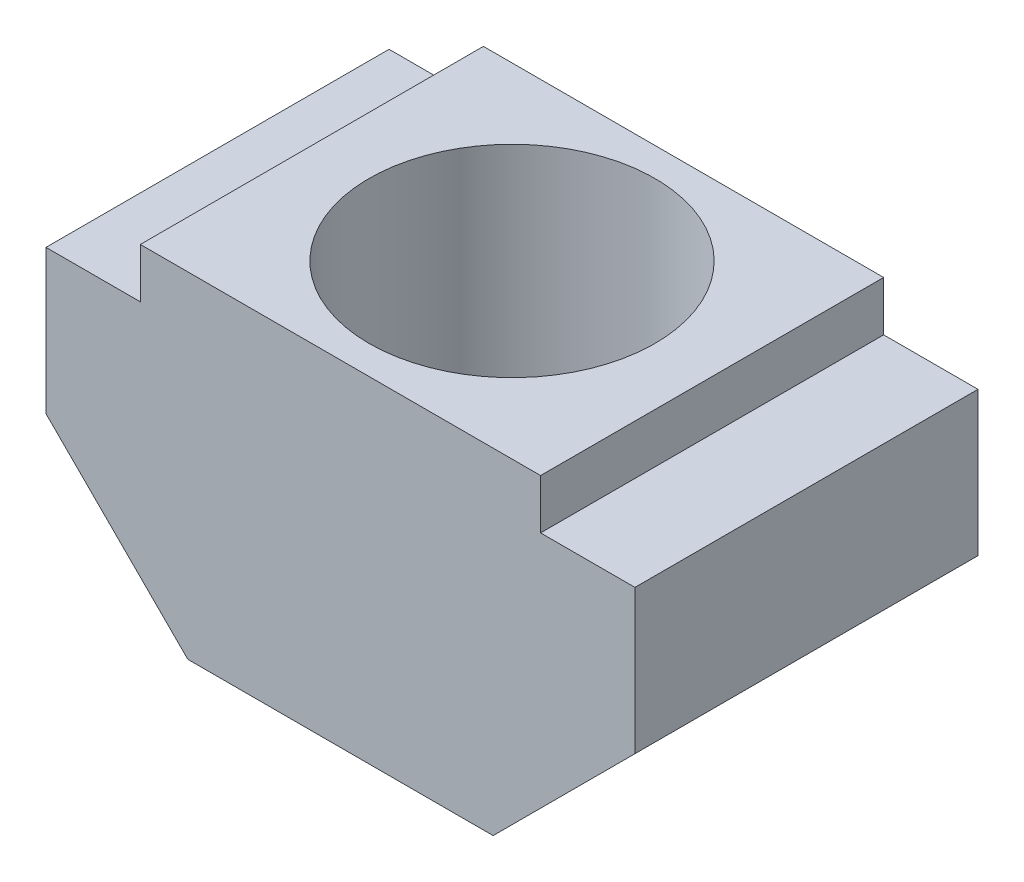
ISO-10303-21;
HEADER;
FILE_DESCRIPTION(('STEP AP214'),'2;1');
FILE_NAME('part.step','',(''),(''),'','','');
FILE_SCHEMA(('AUTOMOTIVE_DESIGN { 1 0 10303 214 1 1 1 1 }'));
ENDSEC;
DATA;
#1=APPLICATION_CONTEXT('core data for automotive mechanical design processes');
#2=APPLICATION_PROTOCOL_DEFINITION('international standard','automotive_design',2000,#1);
#3=PRODUCT_CONTEXT('',#1,'mechanical');
#4=PRODUCT('Part','Part','',(#3));
#5=PRODUCT_RELATED_PRODUCT_CATEGORY('part','',(#4));
#6=PRODUCT_DEFINITION_FORMATION('','',#4);
#7=PRODUCT_DEFINITION_CONTEXT('part definition',#1,'design');
#8=PRODUCT_DEFINITION('design','',#6,#7);
#9=PRODUCT_DEFINITION_SHAPE('','',#8);
#10=(LENGTH_UNIT() NAMED_UNIT(*) SI_UNIT(.MILLI.,.METRE.));
#11=(NAMED_UNIT(*) PLANE_ANGLE_UNIT() SI_UNIT($,.RADIAN.));
#12=(NAMED_UNIT(*) SI_UNIT($,.STERADIAN.) SOLID_ANGLE_UNIT());
#13=UNCERTAINTY_MEASURE_WITH_UNIT(LENGTH_MEASURE(1.E-05),#10,'distance_accuracy_value','');
#14=(GEOMETRIC_REPRESENTATION_CONTEXT(3) GLOBAL_UNCERTAINTY_ASSIGNED_CONTEXT((#13)) GLOBAL_UNIT_ASSIGNED_CONTEXT((#10,
#11,#12)) REPRESENTATION_CONTEXT('',''));
#15=CARTESIAN_POINT('',(0.,0.,0.));
#16=DIRECTION('',(0.,0.,1.));
#17=DIRECTION('',(1.,0.,0.));
#18=AXIS2_PLACEMENT_3D('',#15,#16,#17);
#19=CARTESIAN_POINT('',(-2.66992130891577,0.,6.));
#20=DIRECTION('',(0.707106781186544,0.707106781186551,0.));
#21=DIRECTION('',(-0.707106781186551,0.707106781186544,0.));
#22=AXIS2_PLACEMENT_3D('',#19,#20,#21);
#23=PLANE('',#22);
#24=DIRECTION('',(0.707106781186551,-0.707106781186544,0.));
#25=VECTOR('',#24,1.);
#26=CARTESIAN_POINT('',(-2.66992130891577,0.,0.));
#27=LINE('',#26,#25);
#28=CARTESIAN_POINT('',(-5.15,2.48007869108421,0.));
#29=VERTEX_POINT('',#28);
#30=CARTESIAN_POINT('',(-2.66992130891577,0.,0.));
#31=VERTEX_POINT('',#30);
#32=EDGE_CURVE('E139',#29,#31,#27,.T.);
#33=ORIENTED_EDGE('',*,*,#32,.T.);
#34=DIRECTION('',(0.,0.,-1.));
#35=VECTOR('',#34,1.);
#36=CARTESIAN_POINT('',(-2.66992130891577,0.,6.));
#37=LINE('',#36,#35);
#38=CARTESIAN_POINT('',(-2.66992130891577,0.,6.));
#39=VERTEX_POINT('',#38);
#40=EDGE_CURVE('E11',#39,#31,#37,.T.);
#41=ORIENTED_EDGE('',*,*,#40,.F.);
#42=DIRECTION('',(0.707106781186551,-0.707106781186544,0.));
#43=VECTOR('',#42,1.);
#44=CARTESIAN_POINT('',(-2.66992130891577,0.,6.));
#45=LINE('',#44,#43);
#46=CARTESIAN_POINT('',(-5.15,2.48007869108421,6.));
#47=VERTEX_POINT('',#46);
#48=EDGE_CURVE('E158',#47,#39,#45,.T.);
#49=ORIENTED_EDGE('',*,*,#48,.F.);
#50=DIRECTION('',(0.,0.,-1.));
#51=VECTOR('',#50,1.);
#52=CARTESIAN_POINT('',(-5.15,2.48007869108421,6.));
#53=LINE('',#52,#51);
#54=EDGE_CURVE('E135',#47,#29,#53,.T.);
#55=ORIENTED_EDGE('',*,*,#54,.T.);
#56=EDGE_LOOP('',(#33,#41,#49,#55));
#57=FACE_BOUND('',#56,.T.);
#58=ADVANCED_FACE('F31',(#57),#23,.F.);
#59=CARTESIAN_POINT('',(2.66992130891577,0.,6.));
#60=DIRECTION('',(0.,1.,0.));
#61=DIRECTION('',(0.,0.,1.));
#62=AXIS2_PLACEMENT_3D('',#59,#60,#61);
#63=PLANE('',#62);
#64=CARTESIAN_POINT('',(0.,0.,3.));
#65=DIRECTION('',(0.,1.,0.));
#66=DIRECTION('',(0.,0.,1.));
#67=AXIS2_PLACEMENT_3D('',#64,#65,#66);
#68=CIRCLE('',#67,2.5);
#69=CARTESIAN_POINT('',(0.,0.,5.5));
#70=VERTEX_POINT('',#69);
#71=EDGE_CURVE('E143',#70,#70,#68,.T.);
#72=ORIENTED_EDGE('',*,*,#71,.T.);
#73=EDGE_LOOP('',(#72));
#74=FACE_BOUND('',#73,.T.);
#75=DIRECTION('',(1.,0.,0.));
#76=VECTOR('',#75,1.);
#77=CARTESIAN_POINT('',(2.66992130891577,0.,0.));
#78=LINE('',#77,#76);
#79=CARTESIAN_POINT('',(2.66992130891577,0.,0.));
#80=VERTEX_POINT('',#79);
#81=EDGE_CURVE('E142',#31,#80,#78,.T.);
#82=ORIENTED_EDGE('',*,*,#81,.T.);
#83=DIRECTION('',(0.,0.,-1.));
#84=VECTOR('',#83,1.);
#85=CARTESIAN_POINT('',(2.66992130891577,0.,6.));
#86=LINE('',#85,#84);
#87=CARTESIAN_POINT('',(2.66992130891577,0.,6.));
#88=VERTEX_POINT('',#87);
#89=EDGE_CURVE('E39',#88,#80,#86,.T.);
#90=ORIENTED_EDGE('',*,*,#89,.F.);
#91=DIRECTION('',(1.,0.,0.));
#92=VECTOR('',#91,1.);
#93=CARTESIAN_POINT('',(2.66992130891577,0.,6.));
#94=LINE('',#93,#92);
#95=EDGE_CURVE('E96',#39,#88,#94,.T.);
#96=ORIENTED_EDGE('',*,*,#95,.F.);
#97=ORIENTED_EDGE('',*,*,#40,.T.);
#98=EDGE_LOOP('',(#82,#90,#96,#97));
#99=FACE_BOUND('',#98,.T.);
#100=ADVANCED_FACE('F211',(#74,#99),#63,.F.);
#101=CARTESIAN_POINT('',(2.66992130891577,0.,6.));
#102=DIRECTION('',(-0.707106781186544,0.707106781186551,0.));
#103=DIRECTION('',(-0.707106781186551,-0.707106781186544,0.));
#104=AXIS2_PLACEMENT_3D('',#101,#102,#103);
#105=PLANE('',#104);
#106=DIRECTION('',(0.707106781186551,0.707106781186544,0.));
#107=VECTOR('',#106,1.);
#108=CARTESIAN_POINT('',(2.66992130891577,0.,0.));
#109=LINE('',#108,#107);
#110=CARTESIAN_POINT('',(5.15,2.48007869108421,0.));
#111=VERTEX_POINT('',#110);
#112=EDGE_CURVE('E145',#80,#111,#109,.T.);
#113=ORIENTED_EDGE('',*,*,#112,.T.);
#114=DIRECTION('',(0.,0.,-1.));
#115=VECTOR('',#114,1.);
#116=CARTESIAN_POINT('',(5.15,2.48007869108421,6.));
#117=LINE('',#116,#115);
#118=CARTESIAN_POINT('',(5.15,2.48007869108421,6.));
#119=VERTEX_POINT('',#118);
#120=EDGE_CURVE('E171',#119,#111,#117,.T.);
#121=ORIENTED_EDGE('',*,*,#120,.F.);
#122=DIRECTION('',(0.707106781186551,0.707106781186544,0.));
#123=VECTOR('',#122,1.);
#124=CARTESIAN_POINT('',(2.66992130891577,0.,6.));
#125=LINE('',#124,#123);
#126=EDGE_CURVE('E179',#88,#119,#125,.T.);
#127=ORIENTED_EDGE('',*,*,#126,.F.);
#128=ORIENTED_EDGE('',*,*,#89,.T.);
#129=EDGE_LOOP('',(#113,#121,#127,#128));
#130=FACE_BOUND('',#129,.T.);
#131=ADVANCED_FACE('F177',(#130),#105,.F.);
#132=CARTESIAN_POINT('',(5.15,2.48007869108421,6.));
#133=DIRECTION('',(-1.,0.,0.));
#134=DIRECTION('',(0.,-1.,0.));
#135=AXIS2_PLACEMENT_3D('',#132,#133,#134);
#136=PLANE('',#135);
#137=DIRECTION('',(0.,1.,0.));
#138=VECTOR('',#137,1.);
#139=CARTESIAN_POINT('',(5.15,2.48007869108421,0.));
#140=LINE('',#139,#138);
#141=CARTESIAN_POINT('',(5.15,5.,0.));
#142=VERTEX_POINT('',#141);
#143=EDGE_CURVE('E147',#111,#142,#140,.T.);
#144=ORIENTED_EDGE('',*,*,#143,.T.);
#145=DIRECTION('',(0.,0.,-1.));
#146=VECTOR('',#145,1.);
#147=CARTESIAN_POINT('',(5.15,5.,6.));
#148=LINE('',#147,#146);
#149=CARTESIAN_POINT('',(5.15,5.,6.));
#150=VERTEX_POINT('',#149);
#151=EDGE_CURVE('E168',#150,#142,#148,.T.);
#152=ORIENTED_EDGE('',*,*,#151,.F.);
#153=DIRECTION('',(0.,1.,0.));
#154=VECTOR('',#153,1.);
#155=CARTESIAN_POINT('',(5.15,2.48007869108421,6.));
#156=LINE('',#155,#154);
#157=EDGE_CURVE('E197',#119,#150,#156,.T.);
#158=ORIENTED_EDGE('',*,*,#157,.F.);
#159=ORIENTED_EDGE('',*,*,#120,.T.);
#160=EDGE_LOOP('',(#144,#152,#158,#159));
#161=FACE_BOUND('',#160,.T.);
#162=ADVANCED_FACE('F188',(#161),#136,.F.);
#163=CARTESIAN_POINT('',(5.15,5.,6.));
#164=DIRECTION('',(0.,-1.,0.));
#165=DIRECTION('',(1.,0.,0.));
#166=AXIS2_PLACEMENT_3D('',#163,#164,#165);
#167=PLANE('',#166);
#168=DIRECTION('',(-1.,0.,0.));
#169=VECTOR('',#168,1.);
#170=CARTESIAN_POINT('',(5.15,5.,0.));
#171=LINE('',#170,#169);
#172=CARTESIAN_POINT('',(3.5,5.,0.));
#173=VERTEX_POINT('',#172);
#174=EDGE_CURVE('E149',#142,#173,#171,.T.);
#175=ORIENTED_EDGE('',*,*,#174,.T.);
#176=DIRECTION('',(0.,0.,-1.));
#177=VECTOR('',#176,1.);
#178=CARTESIAN_POINT('',(3.5,5.,6.));
#179=LINE('',#178,#177);
#180=CARTESIAN_POINT('',(3.5,5.,6.));
#181=VERTEX_POINT('',#180);
#182=EDGE_CURVE('E165',#181,#173,#179,.T.);
#183=ORIENTED_EDGE('',*,*,#182,.F.);
#184=DIRECTION('',(-1.,0.,0.));
#185=VECTOR('',#184,1.);
#186=CARTESIAN_POINT('',(5.15,5.,6.));
#187=LINE('',#186,#185);
#188=EDGE_CURVE('E194',#150,#181,#187,.T.);
#189=ORIENTED_EDGE('',*,*,#188,.F.);
#190=ORIENTED_EDGE('',*,*,#151,.T.);
#191=EDGE_LOOP('',(#175,#183,#189,#190));
#192=FACE_BOUND('',#191,.T.);
#193=ADVANCED_FACE('F192',(#192),#167,.F.);
#194=CARTESIAN_POINT('',(3.5,5.,6.));
#195=DIRECTION('',(-1.,0.,0.));
#196=DIRECTION('',(0.,0.,1.));
#197=AXIS2_PLACEMENT_3D('',#194,#195,#196);
#198=PLANE('',#197);
#199=DIRECTION('',(0.,1.,0.));
#200=VECTOR('',#199,1.);
#201=CARTESIAN_POINT('',(3.5,5.,0.));
#202=LINE('',#201,#200);
#203=CARTESIAN_POINT('',(3.5,5.86896879696323,0.));
#204=VERTEX_POINT('',#203);
#205=EDGE_CURVE('E151',#173,#204,#202,.T.);
#206=ORIENTED_EDGE('',*,*,#205,.T.);
#207=DIRECTION('',(0.,0.,-1.));
#208=VECTOR('',#207,1.);
#209=CARTESIAN_POINT('',(3.5,5.86896879696323,6.));
#210=LINE('',#209,#208);
#211=CARTESIAN_POINT('',(3.5,5.86896879696323,6.));
#212=VERTEX_POINT('',#211);
#213=EDGE_CURVE('E162',#212,#204,#210,.T.);
#214=ORIENTED_EDGE('',*,*,#213,.F.);
#215=DIRECTION('',(0.,1.,0.));
#216=VECTOR('',#215,1.);
#217=CARTESIAN_POINT('',(3.5,5.,6.));
#218=LINE('',#217,#216);
#219=EDGE_CURVE('E196',#181,#212,#218,.T.);
#220=ORIENTED_EDGE('',*,*,#219,.F.);
#221=ORIENTED_EDGE('',*,*,#182,.T.);
#222=EDGE_LOOP('',(#206,#214,#220,#221));
#223=FACE_BOUND('',#222,.T.);
#224=ADVANCED_FACE('F222',(#223),#198,.F.);
#225=CARTESIAN_POINT('',(-3.5,5.86896879696323,6.));
#226=DIRECTION('',(0.,-1.,0.));
#227=DIRECTION('',(1.,0.,0.));
#228=AXIS2_PLACEMENT_3D('',#225,#226,#227);
#229=PLANE('',#228);
#230=CARTESIAN_POINT('',(0.,5.86896879696323,3.));
#231=DIRECTION('',(0.,1.,0.));
#232=DIRECTION('',(0.,0.,1.));
#233=AXIS2_PLACEMENT_3D('',#230,#231,#232);
#234=CIRCLE('',#233,2.5);
#235=CARTESIAN_POINT('',(0.,5.86896879696323,5.5));
#236=VERTEX_POINT('',#235);
#237=EDGE_CURVE('E205',#236,#236,#234,.T.);
#238=ORIENTED_EDGE('',*,*,#237,.F.);
#239=EDGE_LOOP('',(#238));
#240=FACE_BOUND('',#239,.T.);
#241=DIRECTION('',(-1.,0.,0.));
#242=VECTOR('',#241,1.);
#243=CARTESIAN_POINT('',(-3.5,5.86896879696323,0.));
#244=LINE('',#243,#242);
#245=CARTESIAN_POINT('',(-3.5,5.86896879696323,0.));
#246=VERTEX_POINT('',#245);
#247=EDGE_CURVE('E153',#204,#246,#244,.T.);
#248=ORIENTED_EDGE('',*,*,#247,.T.);
#249=DIRECTION('',(0.,0.,-1.));
#250=VECTOR('',#249,1.);
#251=CARTESIAN_POINT('',(-3.5,5.86896879696323,6.));
#252=LINE('',#251,#250);
#253=CARTESIAN_POINT('',(-3.5,5.86896879696323,6.));
#254=VERTEX_POINT('',#253);
#255=EDGE_CURVE('E130',#254,#246,#252,.T.);
#256=ORIENTED_EDGE('',*,*,#255,.F.);
#257=DIRECTION('',(-1.,0.,0.));
#258=VECTOR('',#257,1.);
#259=CARTESIAN_POINT('',(-3.5,5.86896879696323,6.));
#260=LINE('',#259,#258);
#261=EDGE_CURVE('E121',#212,#254,#260,.T.);
#262=ORIENTED_EDGE('',*,*,#261,.F.);
#263=ORIENTED_EDGE('',*,*,#213,.T.);
#264=EDGE_LOOP('',(#248,#256,#262,#263));
#265=FACE_BOUND('',#264,.T.);
#266=ADVANCED_FACE('F219',(#240,#265),#229,.F.);
#267=CARTESIAN_POINT('',(-3.5,5.,6.));
#268=DIRECTION('',(1.,0.,0.));
#269=DIRECTION('',(0.,0.,-1.));
#270=AXIS2_PLACEMENT_3D('',#267,#268,#269);
#271=PLANE('',#270);
#272=DIRECTION('',(0.,-1.,0.));
#273=VECTOR('',#272,1.);
#274=CARTESIAN_POINT('',(-3.5,5.,0.));
#275=LINE('',#274,#273);
#276=CARTESIAN_POINT('',(-3.5,5.,0.));
#277=VERTEX_POINT('',#276);
#278=EDGE_CURVE('E129',#246,#277,#275,.T.);
#279=ORIENTED_EDGE('',*,*,#278,.T.);
#280=DIRECTION('',(0.,0.,-1.));
#281=VECTOR('',#280,1.);
#282=CARTESIAN_POINT('',(-3.5,5.,6.));
#283=LINE('',#282,#281);
#284=CARTESIAN_POINT('',(-3.5,5.,6.));
#285=VERTEX_POINT('',#284);
#286=EDGE_CURVE('E126',#285,#277,#283,.T.);
#287=ORIENTED_EDGE('',*,*,#286,.F.);
#288=DIRECTION('',(0.,-1.,0.));
#289=VECTOR('',#288,1.);
#290=CARTESIAN_POINT('',(-3.5,5.,6.));
#291=LINE('',#290,#289);
#292=EDGE_CURVE('E115',#254,#285,#291,.T.);
#293=ORIENTED_EDGE('',*,*,#292,.F.);
#294=ORIENTED_EDGE('',*,*,#255,.T.);
#295=EDGE_LOOP('',(#279,#287,#293,#294));
#296=FACE_BOUND('',#295,.T.);
#297=ADVANCED_FACE('F127',(#296),#271,.F.);
#298=CARTESIAN_POINT('',(-5.15,5.,6.));
#299=DIRECTION('',(0.,-1.,0.));
#300=DIRECTION('',(1.,0.,0.));
#301=AXIS2_PLACEMENT_3D('',#298,#299,#300);
#302=PLANE('',#301);
#303=DIRECTION('',(-1.,0.,0.));
#304=VECTOR('',#303,1.);
#305=CARTESIAN_POINT('',(-5.15,5.,0.));
#306=LINE('',#305,#304);
#307=CARTESIAN_POINT('',(-5.15,5.,0.));
#308=VERTEX_POINT('',#307);
#309=EDGE_CURVE('E82',#277,#308,#306,.T.);
#310=ORIENTED_EDGE('',*,*,#309,.T.);
#311=DIRECTION('',(0.,0.,-1.));
#312=VECTOR('',#311,1.);
#313=CARTESIAN_POINT('',(-5.15,5.,6.));
#314=LINE('',#313,#312);
#315=CARTESIAN_POINT('',(-5.15,5.,6.));
#316=VERTEX_POINT('',#315);
#317=EDGE_CURVE('E131',#316,#308,#314,.T.);
#318=ORIENTED_EDGE('',*,*,#317,.F.);
#319=DIRECTION('',(-1.,0.,0.));
#320=VECTOR('',#319,1.);
#321=CARTESIAN_POINT('',(-5.15,5.,6.));
#322=LINE('',#321,#320);
#323=EDGE_CURVE('E119',#285,#316,#322,.T.);
#324=ORIENTED_EDGE('',*,*,#323,.F.);
#325=ORIENTED_EDGE('',*,*,#286,.T.);
#326=EDGE_LOOP('',(#310,#318,#324,#325));
#327=FACE_BOUND('',#326,.T.);
#328=ADVANCED_FACE('F133',(#327),#302,.F.);
#329=CARTESIAN_POINT('',(-5.15,2.48007869108421,6.));
#330=DIRECTION('',(1.,0.,0.));
#331=DIRECTION('',(0.,1.,0.));
#332=AXIS2_PLACEMENT_3D('',#329,#330,#331);
#333=PLANE('',#332);
#334=DIRECTION('',(0.,-1.,0.));
#335=VECTOR('',#334,1.);
#336=CARTESIAN_POINT('',(-5.15,2.48007869108421,0.));
#337=LINE('',#336,#335);
#338=EDGE_CURVE('E88',#308,#29,#337,.T.);
#339=ORIENTED_EDGE('',*,*,#338,.T.);
#340=ORIENTED_EDGE('',*,*,#54,.F.);
#341=DIRECTION('',(0.,-1.,0.));
#342=VECTOR('',#341,1.);
#343=CARTESIAN_POINT('',(-5.15,2.48007869108421,6.));
#344=LINE('',#343,#342);
#345=EDGE_CURVE('E47',#316,#47,#344,.T.);
#346=ORIENTED_EDGE('',*,*,#345,.F.);
#347=ORIENTED_EDGE('',*,*,#317,.T.);
#348=EDGE_LOOP('',(#339,#340,#346,#347));
#349=FACE_BOUND('',#348,.T.);
#350=ADVANCED_FACE('F229',(#349),#333,.F.);
#351=CARTESIAN_POINT('',(0.,-2.66992130891574,6.));
#352=DIRECTION('',(0.,0.,-1.));
#353=DIRECTION('',(-1.,0.,0.));
#354=AXIS2_PLACEMENT_3D('',#351,#352,#353);
#355=PLANE('',#354);
#356=ORIENTED_EDGE('',*,*,#48,.T.);
#357=ORIENTED_EDGE('',*,*,#95,.T.);
#358=ORIENTED_EDGE('',*,*,#126,.T.);
#359=ORIENTED_EDGE('',*,*,#157,.T.);
#360=ORIENTED_EDGE('',*,*,#188,.T.);
#361=ORIENTED_EDGE('',*,*,#219,.T.);
#362=ORIENTED_EDGE('',*,*,#261,.T.);
#363=ORIENTED_EDGE('',*,*,#292,.T.);
#364=ORIENTED_EDGE('',*,*,#323,.T.);
#365=ORIENTED_EDGE('',*,*,#345,.T.);
#366=EDGE_LOOP('',(#356,#357,#358,#359,#360,#361,#362,#363,#364,#365));
#367=FACE_BOUND('',#366,.T.);
#368=ADVANCED_FACE('F117',(#367),#355,.F.);
#369=CARTESIAN_POINT('',(0.,-2.66992130891574,0.));
#370=DIRECTION('',(0.,0.,-1.));
#371=DIRECTION('',(-1.,0.,0.));
#372=AXIS2_PLACEMENT_3D('',#369,#370,#371);
#373=PLANE('',#372);
#374=ORIENTED_EDGE('',*,*,#32,.F.);
#375=ORIENTED_EDGE('',*,*,#338,.F.);
#376=ORIENTED_EDGE('',*,*,#309,.F.);
#377=ORIENTED_EDGE('',*,*,#278,.F.);
#378=ORIENTED_EDGE('',*,*,#247,.F.);
#379=ORIENTED_EDGE('',*,*,#205,.F.);
#380=ORIENTED_EDGE('',*,*,#174,.F.);
#381=ORIENTED_EDGE('',*,*,#143,.F.);
#382=ORIENTED_EDGE('',*,*,#112,.F.);
#383=ORIENTED_EDGE('',*,*,#81,.F.);
#384=EDGE_LOOP('',(#374,#375,#376,#377,#378,#379,#380,#381,#382,#383));
#385=FACE_BOUND('',#384,.T.);
#386=ADVANCED_FACE('F183',(#385),#373,.T.);
#387=CARTESIAN_POINT('',(0.,0.,3.));
#388=DIRECTION('',(0.,1.,0.));
#389=DIRECTION('',(0.,0.,1.));
#390=AXIS2_PLACEMENT_3D('',#387,#388,#389);
#391=CYLINDRICAL_SURFACE('',#390,2.5);
#392=ORIENTED_EDGE('',*,*,#71,.F.);
#393=EDGE_LOOP('',(#392));
#394=FACE_BOUND('',#393,.T.);
#395=ORIENTED_EDGE('',*,*,#237,.T.);
#396=EDGE_LOOP('',(#395));
#397=FACE_BOUND('',#396,.T.);
#398=ADVANCED_FACE('F213',(#394,#397),#391,.F.);
#399=CLOSED_SHELL('',(#58,#100,#131,#162,#193,#224,#266,#297,#328,#350,#368,#386,#398));
#400=MANIFOLD_SOLID_BREP('B2',#399);
#401=ADVANCED_BREP_SHAPE_REPRESENTATION('',(#18,#400),#14);
#402=SHAPE_DEFINITION_REPRESENTATION(#9,#401);
ENDSEC;
END-ISO-10303-21;
